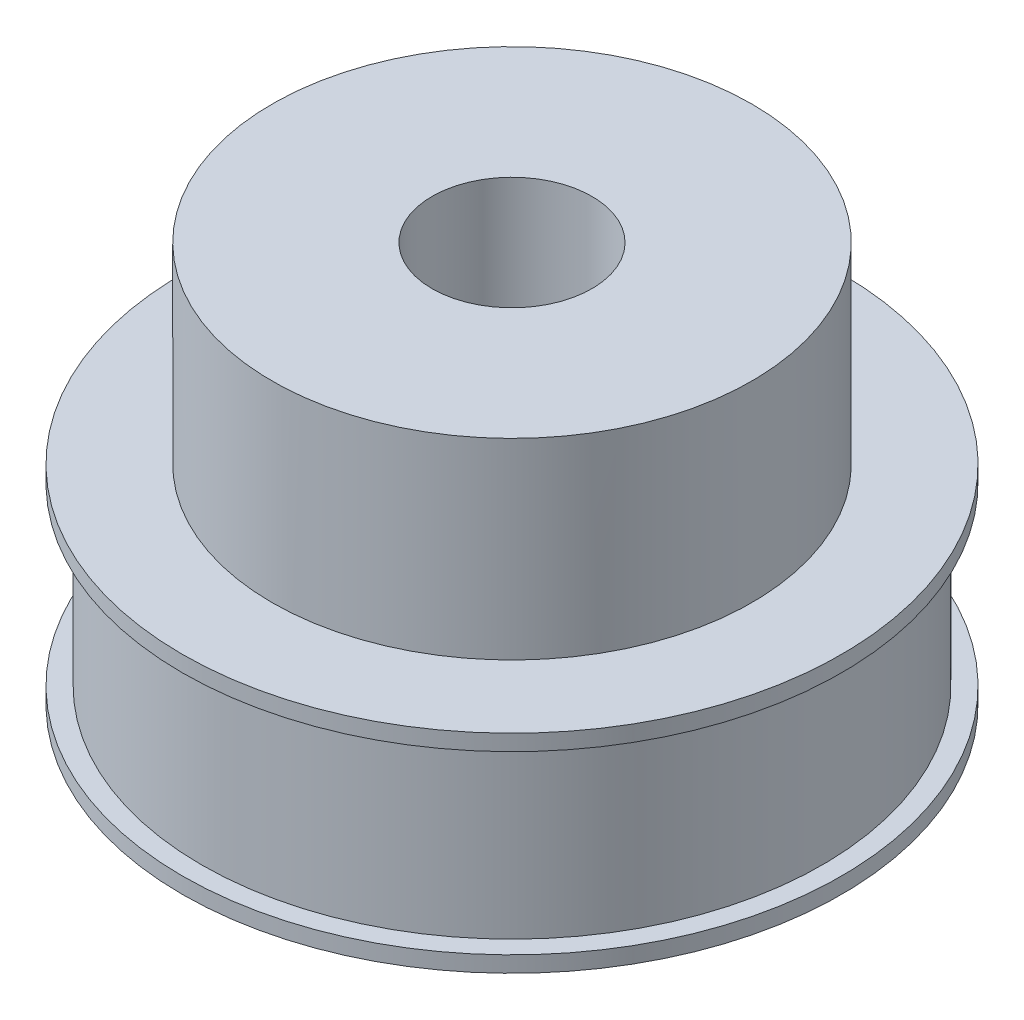
ISO-10303-21;
HEADER;
FILE_DESCRIPTION(('STEP AP214'),'2;1');
FILE_NAME('part.step','',(''),(''),'','','');
FILE_SCHEMA(('AUTOMOTIVE_DESIGN { 1 0 10303 214 1 1 1 1 }'));
ENDSEC;
DATA;
#1=APPLICATION_CONTEXT('core data for automotive mechanical design processes');
#2=APPLICATION_PROTOCOL_DEFINITION('international standard','automotive_design',2000,#1);
#3=PRODUCT_CONTEXT('',#1,'mechanical');
#4=PRODUCT('Part','Part','',(#3));
#5=PRODUCT_RELATED_PRODUCT_CATEGORY('part','',(#4));
#6=PRODUCT_DEFINITION_FORMATION('','',#4);
#7=PRODUCT_DEFINITION_CONTEXT('part definition',#1,'design');
#8=PRODUCT_DEFINITION('design','',#6,#7);
#9=PRODUCT_DEFINITION_SHAPE('','',#8);
#10=(LENGTH_UNIT() NAMED_UNIT(*) SI_UNIT(.MILLI.,.METRE.));
#11=(NAMED_UNIT(*) PLANE_ANGLE_UNIT() SI_UNIT($,.RADIAN.));
#12=(NAMED_UNIT(*) SI_UNIT($,.STERADIAN.) SOLID_ANGLE_UNIT());
#13=UNCERTAINTY_MEASURE_WITH_UNIT(LENGTH_MEASURE(1.E-05),#10,'distance_accuracy_value','');
#14=(GEOMETRIC_REPRESENTATION_CONTEXT(3) GLOBAL_UNCERTAINTY_ASSIGNED_CONTEXT((#13)) GLOBAL_UNIT_ASSIGNED_CONTEXT((#10,
#11,#12)) REPRESENTATION_CONTEXT('',''));
#15=CARTESIAN_POINT('',(0.,0.,0.));
#16=DIRECTION('',(0.,0.,1.));
#17=DIRECTION('',(1.,0.,0.));
#18=AXIS2_PLACEMENT_3D('',#15,#16,#17);
#19=CARTESIAN_POINT('',(0.,11.,0.));
#20=DIRECTION('',(0.,-1.,0.));
#21=DIRECTION('',(0.,0.,-1.));
#22=AXIS2_PLACEMENT_3D('',#19,#20,#21);
#23=CYLINDRICAL_SURFACE('',#22,19.405);
#24=CARTESIAN_POINT('',(0.,11.,0.));
#25=DIRECTION('',(0.,1.,0.));
#26=DIRECTION('',(0.,0.,1.));
#27=AXIS2_PLACEMENT_3D('',#24,#25,#26);
#28=CIRCLE('',#27,19.405);
#29=CARTESIAN_POINT('',(0.,11.,19.405));
#30=VERTEX_POINT('',#29);
#31=EDGE_CURVE('E42',#30,#30,#28,.T.);
#32=ORIENTED_EDGE('',*,*,#31,.F.);
#33=EDGE_LOOP('',(#32));
#34=FACE_BOUND('',#33,.T.);
#35=CARTESIAN_POINT('',(0.,0.,0.));
#36=DIRECTION('',(0.,1.,0.));
#37=DIRECTION('',(0.,0.,1.));
#38=AXIS2_PLACEMENT_3D('',#35,#36,#37);
#39=CIRCLE('',#38,19.405);
#40=CARTESIAN_POINT('',(0.,0.,19.405));
#41=VERTEX_POINT('',#40);
#42=EDGE_CURVE('E38',#41,#41,#39,.T.);
#43=ORIENTED_EDGE('',*,*,#42,.T.);
#44=EDGE_LOOP('',(#43));
#45=FACE_BOUND('',#44,.T.);
#46=ADVANCED_FACE('F35',(#34,#45),#23,.T.);
#47=CARTESIAN_POINT('',(0.,12.,0.));
#48=DIRECTION('',(0.,-1.,0.));
#49=DIRECTION('',(0.,0.,-1.));
#50=AXIS2_PLACEMENT_3D('',#47,#48,#49);
#51=CYLINDRICAL_SURFACE('',#50,20.605);
#52=CARTESIAN_POINT('',(0.,12.,0.));
#53=DIRECTION('',(0.,1.,0.));
#54=DIRECTION('',(0.,0.,1.));
#55=AXIS2_PLACEMENT_3D('',#52,#53,#54);
#56=CIRCLE('',#55,20.605);
#57=CARTESIAN_POINT('',(0.,12.,20.605));
#58=VERTEX_POINT('',#57);
#59=EDGE_CURVE('E47',#58,#58,#56,.T.);
#60=ORIENTED_EDGE('',*,*,#59,.F.);
#61=EDGE_LOOP('',(#60));
#62=FACE_BOUND('',#61,.T.);
#63=CARTESIAN_POINT('',(0.,11.,0.));
#64=DIRECTION('',(0.,1.,0.));
#65=DIRECTION('',(0.,0.,1.));
#66=AXIS2_PLACEMENT_3D('',#63,#64,#65);
#67=CIRCLE('',#66,20.605);
#68=CARTESIAN_POINT('',(0.,11.,20.605));
#69=VERTEX_POINT('',#68);
#70=EDGE_CURVE('E64',#69,#69,#67,.T.);
#71=ORIENTED_EDGE('',*,*,#70,.T.);
#72=EDGE_LOOP('',(#71));
#73=FACE_BOUND('',#72,.T.);
#74=ADVANCED_FACE('F96',(#62,#73),#51,.T.);
#75=CARTESIAN_POINT('',(0.,12.,0.));
#76=DIRECTION('',(0.,1.,0.));
#77=DIRECTION('',(0.,0.,1.));
#78=AXIS2_PLACEMENT_3D('',#75,#76,#77);
#79=PLANE('',#78);
#80=CARTESIAN_POINT('',(0.,12.,0.));
#81=DIRECTION('',(0.,1.,0.));
#82=DIRECTION('',(0.,0.,1.));
#83=AXIS2_PLACEMENT_3D('',#80,#81,#82);
#84=CIRCLE('',#83,15.);
#85=CARTESIAN_POINT('',(0.,12.,15.));
#86=VERTEX_POINT('',#85);
#87=EDGE_CURVE('E11',#86,#86,#84,.T.);
#88=ORIENTED_EDGE('',*,*,#87,.F.);
#89=EDGE_LOOP('',(#88));
#90=FACE_BOUND('',#89,.T.);
#91=ORIENTED_EDGE('',*,*,#59,.T.);
#92=EDGE_LOOP('',(#91));
#93=FACE_BOUND('',#92,.T.);
#94=ADVANCED_FACE('F91',(#90,#93),#79,.T.);
#95=CARTESIAN_POINT('',(0.,11.,0.));
#96=DIRECTION('',(0.,1.,0.));
#97=DIRECTION('',(0.,0.,1.));
#98=AXIS2_PLACEMENT_3D('',#95,#96,#97);
#99=PLANE('',#98);
#100=ORIENTED_EDGE('',*,*,#31,.T.);
#101=EDGE_LOOP('',(#100));
#102=FACE_BOUND('',#101,.T.);
#103=ORIENTED_EDGE('',*,*,#70,.F.);
#104=EDGE_LOOP('',(#103));
#105=FACE_BOUND('',#104,.T.);
#106=ADVANCED_FACE('F82',(#102,#105),#99,.F.);
#107=CARTESIAN_POINT('',(0.,-1.,0.));
#108=DIRECTION('',(0.,1.,0.));
#109=DIRECTION('',(0.,0.,1.));
#110=AXIS2_PLACEMENT_3D('',#107,#108,#109);
#111=CYLINDRICAL_SURFACE('',#110,20.605);
#112=CARTESIAN_POINT('',(0.,-1.,0.));
#113=DIRECTION('',(0.,1.,0.));
#114=DIRECTION('',(0.,0.,1.));
#115=AXIS2_PLACEMENT_3D('',#112,#113,#114);
#116=CIRCLE('',#115,20.605);
#117=CARTESIAN_POINT('',(0.,-1.,20.605));
#118=VERTEX_POINT('',#117);
#119=EDGE_CURVE('E57',#118,#118,#116,.T.);
#120=ORIENTED_EDGE('',*,*,#119,.T.);
#121=EDGE_LOOP('',(#120));
#122=FACE_BOUND('',#121,.T.);
#123=CARTESIAN_POINT('',(0.,0.,0.));
#124=DIRECTION('',(0.,1.,0.));
#125=DIRECTION('',(0.,0.,1.));
#126=AXIS2_PLACEMENT_3D('',#123,#124,#125);
#127=CIRCLE('',#126,20.605);
#128=CARTESIAN_POINT('',(0.,0.,20.605));
#129=VERTEX_POINT('',#128);
#130=EDGE_CURVE('E55',#129,#129,#127,.T.);
#131=ORIENTED_EDGE('',*,*,#130,.F.);
#132=EDGE_LOOP('',(#131));
#133=FACE_BOUND('',#132,.T.);
#134=ADVANCED_FACE('F80',(#122,#133),#111,.T.);
#135=CARTESIAN_POINT('',(0.,-1.,0.));
#136=DIRECTION('',(0.,-1.,0.));
#137=DIRECTION('',(0.,0.,1.));
#138=AXIS2_PLACEMENT_3D('',#135,#136,#137);
#139=PLANE('',#138);
#140=CARTESIAN_POINT('',(0.,-1.,0.));
#141=DIRECTION('',(0.,1.,0.));
#142=DIRECTION('',(0.,0.,1.));
#143=AXIS2_PLACEMENT_3D('',#140,#141,#142);
#144=CIRCLE('',#143,5.);
#145=CARTESIAN_POINT('',(0.,-1.,5.));
#146=VERTEX_POINT('',#145);
#147=EDGE_CURVE('E56',#146,#146,#144,.T.);
#148=ORIENTED_EDGE('',*,*,#147,.T.);
#149=EDGE_LOOP('',(#148));
#150=FACE_BOUND('',#149,.T.);
#151=ORIENTED_EDGE('',*,*,#119,.F.);
#152=EDGE_LOOP('',(#151));
#153=FACE_BOUND('',#152,.T.);
#154=ADVANCED_FACE('F76',(#150,#153),#139,.T.);
#155=CARTESIAN_POINT('',(0.,0.,0.));
#156=DIRECTION('',(0.,-1.,0.));
#157=DIRECTION('',(0.,0.,1.));
#158=AXIS2_PLACEMENT_3D('',#155,#156,#157);
#159=PLANE('',#158);
#160=ORIENTED_EDGE('',*,*,#42,.F.);
#161=EDGE_LOOP('',(#160));
#162=FACE_BOUND('',#161,.T.);
#163=ORIENTED_EDGE('',*,*,#130,.T.);
#164=EDGE_LOOP('',(#163));
#165=FACE_BOUND('',#164,.T.);
#166=ADVANCED_FACE('F72',(#162,#165),#159,.F.);
#167=CARTESIAN_POINT('',(0.,91.4264068711929,0.));
#168=DIRECTION('',(0.,-1.,0.));
#169=DIRECTION('',(0.,0.,-1.));
#170=AXIS2_PLACEMENT_3D('',#167,#168,#169);
#171=CYLINDRICAL_SURFACE('',#170,15.);
#172=CARTESIAN_POINT('',(0.,24.,0.));
#173=DIRECTION('',(0.,-1.,0.));
#174=DIRECTION('',(0.,0.,-1.));
#175=AXIS2_PLACEMENT_3D('',#172,#173,#174);
#176=CIRCLE('',#175,15.);
#177=CARTESIAN_POINT('',(0.,24.,-15.));
#178=VERTEX_POINT('',#177);
#179=EDGE_CURVE('E52',#178,#178,#176,.T.);
#180=ORIENTED_EDGE('',*,*,#179,.T.);
#181=EDGE_LOOP('',(#180));
#182=FACE_BOUND('',#181,.T.);
#183=ORIENTED_EDGE('',*,*,#87,.T.);
#184=EDGE_LOOP('',(#183));
#185=FACE_BOUND('',#184,.T.);
#186=ADVANCED_FACE('F75',(#182,#185),#171,.T.);
#187=CARTESIAN_POINT('',(0.,24.,0.));
#188=DIRECTION('',(0.,-1.,0.));
#189=DIRECTION('',(0.,0.,1.));
#190=AXIS2_PLACEMENT_3D('',#187,#188,#189);
#191=PLANE('',#190);
#192=CARTESIAN_POINT('',(0.,24.,0.));
#193=DIRECTION('',(0.,1.,0.));
#194=DIRECTION('',(0.,0.,1.));
#195=AXIS2_PLACEMENT_3D('',#192,#193,#194);
#196=CIRCLE('',#195,5.);
#197=CARTESIAN_POINT('',(0.,24.,5.));
#198=VERTEX_POINT('',#197);
#199=EDGE_CURVE('E50',#198,#198,#196,.T.);
#200=ORIENTED_EDGE('',*,*,#199,.F.);
#201=EDGE_LOOP('',(#200));
#202=FACE_BOUND('',#201,.T.);
#203=ORIENTED_EDGE('',*,*,#179,.F.);
#204=EDGE_LOOP('',(#203));
#205=FACE_BOUND('',#204,.T.);
#206=ADVANCED_FACE('F140',(#202,#205),#191,.F.);
#207=CARTESIAN_POINT('',(0.,-1.,0.));
#208=DIRECTION('',(0.,1.,0.));
#209=DIRECTION('',(0.,0.,1.));
#210=AXIS2_PLACEMENT_3D('',#207,#208,#209);
#211=CYLINDRICAL_SURFACE('',#210,5.);
#212=ORIENTED_EDGE('',*,*,#147,.F.);
#213=EDGE_LOOP('',(#212));
#214=FACE_BOUND('',#213,.T.);
#215=ORIENTED_EDGE('',*,*,#199,.T.);
#216=EDGE_LOOP('',(#215));
#217=FACE_BOUND('',#216,.T.);
#218=ADVANCED_FACE('F147',(#214,#217),#211,.F.);
#219=CLOSED_SHELL('',(#46,#74,#94,#106,#134,#154,#166,#186,#206,#218));
#220=MANIFOLD_SOLID_BREP('B2',#219);
#221=ADVANCED_BREP_SHAPE_REPRESENTATION('',(#18,#220),#14);
#222=SHAPE_DEFINITION_REPRESENTATION(#9,#221);
ENDSEC;
END-ISO-10303-21;
